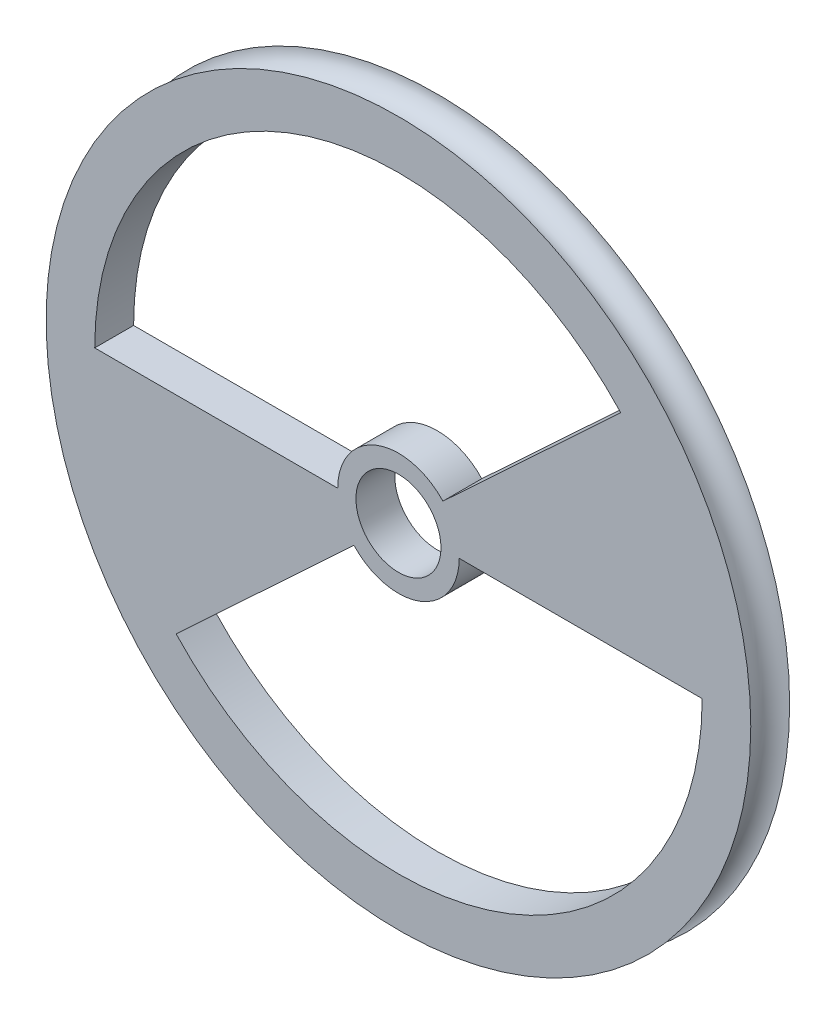
ISO-10303-21;
HEADER;
FILE_DESCRIPTION(('STEP AP214'),'2;1');
FILE_NAME('part.step','',(''),(''),'','','');
FILE_SCHEMA(('AUTOMOTIVE_DESIGN { 1 0 10303 214 1 1 1 1 }'));
ENDSEC;
DATA;
#1=APPLICATION_CONTEXT('core data for automotive mechanical design processes');
#2=APPLICATION_PROTOCOL_DEFINITION('international standard','automotive_design',2000,#1);
#3=PRODUCT_CONTEXT('',#1,'mechanical');
#4=PRODUCT('Part','Part','',(#3));
#5=PRODUCT_RELATED_PRODUCT_CATEGORY('part','',(#4));
#6=PRODUCT_DEFINITION_FORMATION('','',#4);
#7=PRODUCT_DEFINITION_CONTEXT('part definition',#1,'design');
#8=PRODUCT_DEFINITION('design','',#6,#7);
#9=PRODUCT_DEFINITION_SHAPE('','',#8);
#10=(LENGTH_UNIT() NAMED_UNIT(*) SI_UNIT(.MILLI.,.METRE.));
#11=(NAMED_UNIT(*) PLANE_ANGLE_UNIT() SI_UNIT($,.RADIAN.));
#12=(NAMED_UNIT(*) SI_UNIT($,.STERADIAN.) SOLID_ANGLE_UNIT());
#13=UNCERTAINTY_MEASURE_WITH_UNIT(LENGTH_MEASURE(1.E-05),#10,'distance_accuracy_value','');
#14=(GEOMETRIC_REPRESENTATION_CONTEXT(3) GLOBAL_UNCERTAINTY_ASSIGNED_CONTEXT((#13)) GLOBAL_UNIT_ASSIGNED_CONTEXT((#10,
#11,#12)) REPRESENTATION_CONTEXT('',''));
#15=CARTESIAN_POINT('',(0.,0.,0.));
#16=DIRECTION('',(0.,0.,1.));
#17=DIRECTION('',(1.,0.,0.));
#18=AXIS2_PLACEMENT_3D('',#15,#16,#17);
#19=CARTESIAN_POINT('',(0.,0.,3.2));
#20=DIRECTION('',(0.681310769976636,-0.731994285984422,0.));
#21=DIRECTION('',(0.731994285984422,0.681310769976636,0.));
#22=AXIS2_PLACEMENT_3D('',#19,#20,#21);
#23=PLANE('',#22);
#24=DIRECTION('',(-0.731994285984422,-0.681310769976636,0.));
#25=VECTOR('',#24,1.);
#26=CARTESIAN_POINT('',(0.,0.,0.));
#27=LINE('',#26,#25);
#28=CARTESIAN_POINT('',(-3.65997142992211,-3.40655384988318,0.));
#29=VERTEX_POINT('',#28);
#30=CARTESIAN_POINT('',(-18.2998571496106,-17.0327692494159,0.));
#31=VERTEX_POINT('',#30);
#32=EDGE_CURVE('E153',#29,#31,#27,.T.);
#33=ORIENTED_EDGE('',*,*,#32,.F.);
#34=DIRECTION('',(0.,0.,-1.));
#35=VECTOR('',#34,1.);
#36=CARTESIAN_POINT('',(-3.65997142992211,-3.40655384988318,3.2));
#37=LINE('',#36,#35);
#38=CARTESIAN_POINT('',(-3.65997142992211,-3.40655384988318,3.2));
#39=VERTEX_POINT('',#38);
#40=EDGE_CURVE('E11',#39,#29,#37,.T.);
#41=ORIENTED_EDGE('',*,*,#40,.F.);
#42=DIRECTION('',(-0.731994285984422,-0.681310769976636,0.));
#43=VECTOR('',#42,1.);
#44=CARTESIAN_POINT('',(0.,0.,3.2));
#45=LINE('',#44,#43);
#46=CARTESIAN_POINT('',(-18.2998571496106,-17.0327692494159,3.2));
#47=VERTEX_POINT('',#46);
#48=EDGE_CURVE('E121',#39,#47,#45,.T.);
#49=ORIENTED_EDGE('',*,*,#48,.T.);
#50=DIRECTION('',(0.,0.,-1.));
#51=VECTOR('',#50,1.);
#52=CARTESIAN_POINT('',(-18.2998571496106,-17.0327692494159,3.2));
#53=LINE('',#52,#51);
#54=EDGE_CURVE('E54',#47,#31,#53,.T.);
#55=ORIENTED_EDGE('',*,*,#54,.T.);
#56=EDGE_LOOP('',(#33,#41,#49,#55));
#57=FACE_BOUND('',#56,.T.);
#58=ADVANCED_FACE('F35',(#57),#23,.T.);
#59=CARTESIAN_POINT('',(0.,0.,3.2));
#60=DIRECTION('',(0.,0.,-1.));
#61=DIRECTION('',(-1.,0.,0.));
#62=AXIS2_PLACEMENT_3D('',#59,#60,#61);
#63=CYLINDRICAL_SURFACE('',#62,5.);
#64=CARTESIAN_POINT('',(0.,0.,0.));
#65=DIRECTION('',(0.,0.,1.));
#66=DIRECTION('',(1.,0.,0.));
#67=AXIS2_PLACEMENT_3D('',#64,#65,#66);
#68=CIRCLE('',#67,5.);
#69=CARTESIAN_POINT('',(5.,0.,0.));
#70=VERTEX_POINT('',#69);
#71=EDGE_CURVE('E127',#29,#70,#68,.T.);
#72=ORIENTED_EDGE('',*,*,#71,.T.);
#73=DIRECTION('',(0.,0.,-1.));
#74=VECTOR('',#73,1.);
#75=CARTESIAN_POINT('',(5.,0.,3.2));
#76=LINE('',#75,#74);
#77=CARTESIAN_POINT('',(5.,0.,3.2));
#78=VERTEX_POINT('',#77);
#79=EDGE_CURVE('E45',#78,#70,#76,.T.);
#80=ORIENTED_EDGE('',*,*,#79,.F.);
#81=CARTESIAN_POINT('',(0.,0.,3.2));
#82=DIRECTION('',(0.,0.,1.));
#83=DIRECTION('',(1.,0.,0.));
#84=AXIS2_PLACEMENT_3D('',#81,#82,#83);
#85=CIRCLE('',#84,5.);
#86=EDGE_CURVE('E115',#39,#78,#85,.T.);
#87=ORIENTED_EDGE('',*,*,#86,.F.);
#88=ORIENTED_EDGE('',*,*,#40,.T.);
#89=EDGE_LOOP('',(#72,#80,#87,#88));
#90=FACE_BOUND('',#89,.T.);
#91=ADVANCED_FACE('F125',(#90),#63,.T.);
#92=CARTESIAN_POINT('',(0.,0.,3.2));
#93=DIRECTION('',(0.,1.,0.));
#94=DIRECTION('',(-1.,0.,0.));
#95=AXIS2_PLACEMENT_3D('',#92,#93,#94);
#96=PLANE('',#95);
#97=DIRECTION('',(1.,0.,0.));
#98=VECTOR('',#97,1.);
#99=CARTESIAN_POINT('',(0.,0.,0.));
#100=LINE('',#99,#98);
#101=CARTESIAN_POINT('',(25.,0.,0.));
#102=VERTEX_POINT('',#101);
#103=EDGE_CURVE('E151',#70,#102,#100,.T.);
#104=ORIENTED_EDGE('',*,*,#103,.T.);
#105=DIRECTION('',(0.,0.,-1.));
#106=VECTOR('',#105,1.);
#107=CARTESIAN_POINT('',(25.,0.,3.2));
#108=LINE('',#107,#106);
#109=CARTESIAN_POINT('',(25.,0.,3.2));
#110=VERTEX_POINT('',#109);
#111=EDGE_CURVE('E80',#110,#102,#108,.T.);
#112=ORIENTED_EDGE('',*,*,#111,.F.);
#113=DIRECTION('',(1.,0.,0.));
#114=VECTOR('',#113,1.);
#115=CARTESIAN_POINT('',(0.,0.,3.2));
#116=LINE('',#115,#114);
#117=EDGE_CURVE('E107',#78,#110,#116,.T.);
#118=ORIENTED_EDGE('',*,*,#117,.F.);
#119=ORIENTED_EDGE('',*,*,#79,.T.);
#120=EDGE_LOOP('',(#104,#112,#118,#119));
#121=FACE_BOUND('',#120,.T.);
#122=ADVANCED_FACE('F109',(#121),#96,.F.);
#123=CARTESIAN_POINT('',(0.,0.,3.2));
#124=DIRECTION('',(-0.681310769976636,0.731994285984422,0.));
#125=DIRECTION('',(-0.731994285984422,-0.681310769976636,0.));
#126=AXIS2_PLACEMENT_3D('',#123,#124,#125);
#127=PLANE('',#126);
#128=DIRECTION('',(0.731994285984422,0.681310769976636,0.));
#129=VECTOR('',#128,1.);
#130=CARTESIAN_POINT('',(0.,0.,0.));
#131=LINE('',#130,#129);
#132=CARTESIAN_POINT('',(3.65997142992211,3.40655384988318,0.));
#133=VERTEX_POINT('',#132);
#134=CARTESIAN_POINT('',(18.2998571496106,17.0327692494159,0.));
#135=VERTEX_POINT('',#134);
#136=EDGE_CURVE('E162',#133,#135,#131,.T.);
#137=ORIENTED_EDGE('',*,*,#136,.F.);
#138=DIRECTION('',(0.,0.,-1.));
#139=VECTOR('',#138,1.);
#140=CARTESIAN_POINT('',(3.65997142992211,3.40655384988318,3.2));
#141=LINE('',#140,#139);
#142=CARTESIAN_POINT('',(3.65997142992211,3.40655384988318,3.2));
#143=VERTEX_POINT('',#142);
#144=EDGE_CURVE('E39',#143,#133,#141,.T.);
#145=ORIENTED_EDGE('',*,*,#144,.F.);
#146=DIRECTION('',(0.731994285984422,0.681310769976636,0.));
#147=VECTOR('',#146,1.);
#148=CARTESIAN_POINT('',(0.,0.,3.2));
#149=LINE('',#148,#147);
#150=CARTESIAN_POINT('',(18.2998571496106,17.0327692494159,3.2));
#151=VERTEX_POINT('',#150);
#152=EDGE_CURVE('E149',#143,#151,#149,.T.);
#153=ORIENTED_EDGE('',*,*,#152,.T.);
#154=DIRECTION('',(0.,0.,-1.));
#155=VECTOR('',#154,1.);
#156=CARTESIAN_POINT('',(18.2998571496106,17.0327692494159,3.2));
#157=LINE('',#156,#155);
#158=EDGE_CURVE('E132',#151,#135,#157,.T.);
#159=ORIENTED_EDGE('',*,*,#158,.T.);
#160=EDGE_LOOP('',(#137,#145,#153,#159));
#161=FACE_BOUND('',#160,.T.);
#162=ADVANCED_FACE('F37',(#161),#127,.T.);
#163=CARTESIAN_POINT('',(-5.,0.,0.));
#164=VERTEX_POINT('',#163);
#165=EDGE_CURVE('E160',#133,#164,#68,.T.);
#166=ORIENTED_EDGE('',*,*,#165,.T.);
#167=DIRECTION('',(0.,0.,-1.));
#168=VECTOR('',#167,1.);
#169=CARTESIAN_POINT('',(-5.,0.,3.2));
#170=LINE('',#169,#168);
#171=CARTESIAN_POINT('',(-5.,0.,3.2));
#172=VERTEX_POINT('',#171);
#173=EDGE_CURVE('E136',#172,#164,#170,.T.);
#174=ORIENTED_EDGE('',*,*,#173,.F.);
#175=EDGE_CURVE('E124',#143,#172,#85,.T.);
#176=ORIENTED_EDGE('',*,*,#175,.F.);
#177=ORIENTED_EDGE('',*,*,#144,.T.);
#178=EDGE_LOOP('',(#166,#174,#176,#177));
#179=FACE_BOUND('',#178,.T.);
#180=ADVANCED_FACE('F215',(#179),#63,.T.);
#181=CARTESIAN_POINT('',(0.,0.,3.2));
#182=DIRECTION('',(0.,-1.,0.));
#183=DIRECTION('',(1.,0.,0.));
#184=AXIS2_PLACEMENT_3D('',#181,#182,#183);
#185=PLANE('',#184);
#186=DIRECTION('',(-1.,0.,0.));
#187=VECTOR('',#186,1.);
#188=CARTESIAN_POINT('',(0.,0.,0.));
#189=LINE('',#188,#187);
#190=CARTESIAN_POINT('',(-25.,0.,0.));
#191=VERTEX_POINT('',#190);
#192=EDGE_CURVE('E158',#164,#191,#189,.T.);
#193=ORIENTED_EDGE('',*,*,#192,.T.);
#194=DIRECTION('',(0.,0.,-1.));
#195=VECTOR('',#194,1.);
#196=CARTESIAN_POINT('',(-25.,0.,3.2));
#197=LINE('',#196,#195);
#198=CARTESIAN_POINT('',(-25.,0.,3.2));
#199=VERTEX_POINT('',#198);
#200=EDGE_CURVE('E134',#199,#191,#197,.T.);
#201=ORIENTED_EDGE('',*,*,#200,.F.);
#202=DIRECTION('',(-1.,0.,0.));
#203=VECTOR('',#202,1.);
#204=CARTESIAN_POINT('',(0.,0.,3.2));
#205=LINE('',#204,#203);
#206=EDGE_CURVE('E172',#172,#199,#205,.T.);
#207=ORIENTED_EDGE('',*,*,#206,.F.);
#208=ORIENTED_EDGE('',*,*,#173,.T.);
#209=EDGE_LOOP('',(#193,#201,#207,#208));
#210=FACE_BOUND('',#209,.T.);
#211=ADVANCED_FACE('F217',(#210),#185,.F.);
#212=CARTESIAN_POINT('',(0.,0.,3.2));
#213=DIRECTION('',(0.,0.,-1.));
#214=DIRECTION('',(-1.,0.,0.));
#215=AXIS2_PLACEMENT_3D('',#212,#213,#214);
#216=CYLINDRICAL_SURFACE('',#215,25.);
#217=CARTESIAN_POINT('',(0.,0.,0.));
#218=DIRECTION('',(0.,0.,1.));
#219=DIRECTION('',(1.,0.,0.));
#220=AXIS2_PLACEMENT_3D('',#217,#218,#219);
#221=CIRCLE('',#220,25.);
#222=EDGE_CURVE('E150',#31,#102,#221,.T.);
#223=ORIENTED_EDGE('',*,*,#222,.F.);
#224=ORIENTED_EDGE('',*,*,#54,.F.);
#225=CARTESIAN_POINT('',(0.,0.,3.2));
#226=DIRECTION('',(0.,0.,1.));
#227=DIRECTION('',(1.,0.,0.));
#228=AXIS2_PLACEMENT_3D('',#225,#226,#227);
#229=CIRCLE('',#228,25.);
#230=EDGE_CURVE('E114',#47,#110,#229,.T.);
#231=ORIENTED_EDGE('',*,*,#230,.T.);
#232=ORIENTED_EDGE('',*,*,#111,.T.);
#233=EDGE_LOOP('',(#223,#224,#231,#232));
#234=FACE_BOUND('',#233,.T.);
#235=ADVANCED_FACE('F206',(#234),#216,.F.);
#236=EDGE_CURVE('E155',#135,#191,#221,.T.);
#237=ORIENTED_EDGE('',*,*,#236,.F.);
#238=ORIENTED_EDGE('',*,*,#158,.F.);
#239=EDGE_CURVE('E169',#151,#199,#229,.T.);
#240=ORIENTED_EDGE('',*,*,#239,.T.);
#241=ORIENTED_EDGE('',*,*,#200,.T.);
#242=EDGE_LOOP('',(#237,#238,#240,#241));
#243=FACE_BOUND('',#242,.T.);
#244=ADVANCED_FACE('F197',(#243),#216,.F.);
#245=CARTESIAN_POINT('',(0.,0.,3.2));
#246=DIRECTION('',(0.,0.,-1.));
#247=DIRECTION('',(-1.,0.,0.));
#248=AXIS2_PLACEMENT_3D('',#245,#246,#247);
#249=CYLINDRICAL_SURFACE('',#248,3.5);
#250=CARTESIAN_POINT('',(0.,0.,3.2));
#251=DIRECTION('',(0.,0.,1.));
#252=DIRECTION('',(1.,0.,0.));
#253=AXIS2_PLACEMENT_3D('',#250,#251,#252);
#254=CIRCLE('',#253,3.5);
#255=CARTESIAN_POINT('',(3.5,0.,3.2));
#256=VERTEX_POINT('',#255);
#257=EDGE_CURVE('E135',#256,#256,#254,.T.);
#258=ORIENTED_EDGE('',*,*,#257,.T.);
#259=EDGE_LOOP('',(#258));
#260=FACE_BOUND('',#259,.T.);
#261=CARTESIAN_POINT('',(0.,0.,0.));
#262=DIRECTION('',(0.,0.,1.));
#263=DIRECTION('',(1.,0.,0.));
#264=AXIS2_PLACEMENT_3D('',#261,#262,#263);
#265=CIRCLE('',#264,3.5);
#266=CARTESIAN_POINT('',(3.5,0.,0.));
#267=VERTEX_POINT('',#266);
#268=EDGE_CURVE('E146',#267,#267,#265,.T.);
#269=ORIENTED_EDGE('',*,*,#268,.F.);
#270=EDGE_LOOP('',(#269));
#271=FACE_BOUND('',#270,.T.);
#272=ADVANCED_FACE('F195',(#260,#271),#249,.F.);
#273=CARTESIAN_POINT('',(0.,0.,3.2));
#274=DIRECTION('',(0.,0.,1.));
#275=DIRECTION('',(1.,0.,0.));
#276=AXIS2_PLACEMENT_3D('',#273,#274,#275);
#277=PLANE('',#276);
#278=ORIENTED_EDGE('',*,*,#152,.F.);
#279=ORIENTED_EDGE('',*,*,#175,.T.);
#280=ORIENTED_EDGE('',*,*,#206,.T.);
#281=ORIENTED_EDGE('',*,*,#239,.F.);
#282=EDGE_LOOP('',(#278,#279,#280,#281));
#283=FACE_BOUND('',#282,.T.);
#284=ORIENTED_EDGE('',*,*,#48,.F.);
#285=ORIENTED_EDGE('',*,*,#86,.T.);
#286=ORIENTED_EDGE('',*,*,#117,.T.);
#287=ORIENTED_EDGE('',*,*,#230,.F.);
#288=EDGE_LOOP('',(#284,#285,#286,#287));
#289=FACE_BOUND('',#288,.T.);
#290=CARTESIAN_POINT('',(0.,0.,3.2));
#291=DIRECTION('',(0.,0.,1.));
#292=DIRECTION('',(1.,0.,0.));
#293=AXIS2_PLACEMENT_3D('',#290,#291,#292);
#294=CIRCLE('',#293,29.);
#295=CARTESIAN_POINT('',(29.,0.,3.2));
#296=VERTEX_POINT('',#295);
#297=EDGE_CURVE('E177',#296,#296,#294,.T.);
#298=ORIENTED_EDGE('',*,*,#297,.T.);
#299=EDGE_LOOP('',(#298));
#300=FACE_BOUND('',#299,.T.);
#301=ORIENTED_EDGE('',*,*,#257,.F.);
#302=EDGE_LOOP('',(#301));
#303=FACE_BOUND('',#302,.T.);
#304=ADVANCED_FACE('F119',(#283,#289,#300,#303),#277,.T.);
#305=CARTESIAN_POINT('',(0.,0.,0.));
#306=DIRECTION('',(0.,0.,1.));
#307=DIRECTION('',(1.,0.,0.));
#308=AXIS2_PLACEMENT_3D('',#305,#306,#307);
#309=PLANE('',#308);
#310=ORIENTED_EDGE('',*,*,#136,.T.);
#311=ORIENTED_EDGE('',*,*,#236,.T.);
#312=ORIENTED_EDGE('',*,*,#192,.F.);
#313=ORIENTED_EDGE('',*,*,#165,.F.);
#314=EDGE_LOOP('',(#310,#311,#312,#313));
#315=FACE_BOUND('',#314,.T.);
#316=ORIENTED_EDGE('',*,*,#32,.T.);
#317=ORIENTED_EDGE('',*,*,#222,.T.);
#318=ORIENTED_EDGE('',*,*,#103,.F.);
#319=ORIENTED_EDGE('',*,*,#71,.F.);
#320=EDGE_LOOP('',(#316,#317,#318,#319));
#321=FACE_BOUND('',#320,.T.);
#322=CARTESIAN_POINT('',(0.,0.,0.));
#323=DIRECTION('',(0.,0.,1.));
#324=DIRECTION('',(1.,0.,0.));
#325=AXIS2_PLACEMENT_3D('',#322,#323,#324);
#326=CIRCLE('',#325,29.);
#327=CARTESIAN_POINT('',(29.,0.,0.));
#328=VERTEX_POINT('',#327);
#329=EDGE_CURVE('E165',#328,#328,#326,.T.);
#330=ORIENTED_EDGE('',*,*,#329,.F.);
#331=EDGE_LOOP('',(#330));
#332=FACE_BOUND('',#331,.T.);
#333=ORIENTED_EDGE('',*,*,#268,.T.);
#334=EDGE_LOOP('',(#333));
#335=FACE_BOUND('',#334,.T.);
#336=ADVANCED_FACE('F185',(#315,#321,#332,#335),#309,.F.);
#337=CARTESIAN_POINT('',(0.,0.,1.6));
#338=DIRECTION('',(0.,0.,1.));
#339=DIRECTION('',(1.,0.,0.));
#340=AXIS2_PLACEMENT_3D('',#337,#338,#339);
#341=TOROIDAL_SURFACE('',#340,29.,1.6);
#342=ORIENTED_EDGE('',*,*,#297,.F.);
#343=EDGE_LOOP('',(#342));
#344=FACE_BOUND('',#343,.T.);
#345=ORIENTED_EDGE('',*,*,#329,.T.);
#346=EDGE_LOOP('',(#345));
#347=FACE_BOUND('',#346,.T.);
#348=ADVANCED_FACE('F182',(#344,#347),#341,.F.);
#349=CLOSED_SHELL('',(#58,#91,#122,#162,#180,#211,#235,#244,#272,#304,#336,#348));
#350=MANIFOLD_SOLID_BREP('B2',#349);
#351=ADVANCED_BREP_SHAPE_REPRESENTATION('',(#18,#350),#14);
#352=SHAPE_DEFINITION_REPRESENTATION(#9,#351);
ENDSEC;
END-ISO-10303-21;
